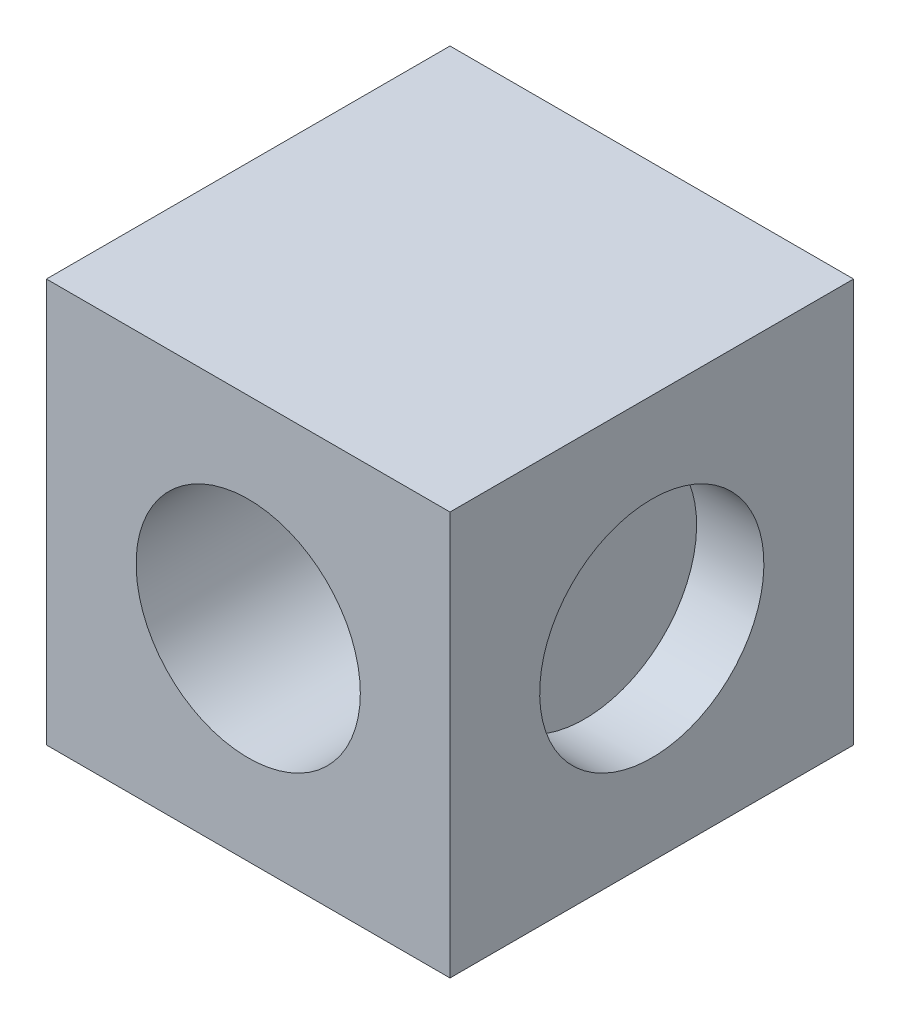
ISO-10303-21;
HEADER;
FILE_DESCRIPTION(('STEP AP214'),'2;1');
FILE_NAME('part.step','',(''),(''),'','','');
FILE_SCHEMA(('AUTOMOTIVE_DESIGN { 1 0 10303 214 1 1 1 1 }'));
ENDSEC;
DATA;
#1=APPLICATION_CONTEXT('core data for automotive mechanical design processes');
#2=APPLICATION_PROTOCOL_DEFINITION('international standard','automotive_design',2000,#1);
#3=PRODUCT_CONTEXT('',#1,'mechanical');
#4=PRODUCT('Part','Part','',(#3));
#5=PRODUCT_RELATED_PRODUCT_CATEGORY('part','',(#4));
#6=PRODUCT_DEFINITION_FORMATION('','',#4);
#7=PRODUCT_DEFINITION_CONTEXT('part definition',#1,'design');
#8=PRODUCT_DEFINITION('design','',#6,#7);
#9=PRODUCT_DEFINITION_SHAPE('','',#8);
#10=(LENGTH_UNIT() NAMED_UNIT(*) SI_UNIT(.MILLI.,.METRE.));
#11=(NAMED_UNIT(*) PLANE_ANGLE_UNIT() SI_UNIT($,.RADIAN.));
#12=(NAMED_UNIT(*) SI_UNIT($,.STERADIAN.) SOLID_ANGLE_UNIT());
#13=UNCERTAINTY_MEASURE_WITH_UNIT(LENGTH_MEASURE(1.E-05),#10,'distance_accuracy_value','');
#14=(GEOMETRIC_REPRESENTATION_CONTEXT(3) GLOBAL_UNCERTAINTY_ASSIGNED_CONTEXT((#13)) GLOBAL_UNIT_ASSIGNED_CONTEXT((#10,
#11,#12)) REPRESENTATION_CONTEXT('',''));
#15=CARTESIAN_POINT('',(0.,0.,0.));
#16=DIRECTION('',(0.,0.,1.));
#17=DIRECTION('',(1.,0.,0.));
#18=AXIS2_PLACEMENT_3D('',#15,#16,#17);
#19=CARTESIAN_POINT('',(0.,0.,18.));
#20=DIRECTION('',(0.,0.,1.));
#21=DIRECTION('',(1.,0.,0.));
#22=AXIS2_PLACEMENT_3D('',#19,#20,#21);
#23=PLANE('',#22);
#24=DIRECTION('',(0.,1.,0.));
#25=VECTOR('',#24,1.);
#26=CARTESIAN_POINT('',(9.,9.,18.));
#27=LINE('',#26,#25);
#28=CARTESIAN_POINT('',(9.,-9.,18.));
#29=VERTEX_POINT('',#28);
#30=CARTESIAN_POINT('',(9.,9.,18.));
#31=VERTEX_POINT('',#30);
#32=EDGE_CURVE('E91',#29,#31,#27,.T.);
#33=ORIENTED_EDGE('',*,*,#32,.T.);
#34=DIRECTION('',(-1.,0.,0.));
#35=VECTOR('',#34,1.);
#36=CARTESIAN_POINT('',(-9.,9.,18.));
#37=LINE('',#36,#35);
#38=CARTESIAN_POINT('',(-9.,9.,18.));
#39=VERTEX_POINT('',#38);
#40=EDGE_CURVE('E86',#31,#39,#37,.T.);
#41=ORIENTED_EDGE('',*,*,#40,.T.);
#42=DIRECTION('',(0.,-1.,0.));
#43=VECTOR('',#42,1.);
#44=CARTESIAN_POINT('',(-9.,9.,18.));
#45=LINE('',#44,#43);
#46=CARTESIAN_POINT('',(-9.,-9.,18.));
#47=VERTEX_POINT('',#46);
#48=EDGE_CURVE('E89',#39,#47,#45,.T.);
#49=ORIENTED_EDGE('',*,*,#48,.T.);
#50=DIRECTION('',(1.,0.,0.));
#51=VECTOR('',#50,1.);
#52=CARTESIAN_POINT('',(-9.,-9.,18.));
#53=LINE('',#52,#51);
#54=EDGE_CURVE('E56',#47,#29,#53,.T.);
#55=ORIENTED_EDGE('',*,*,#54,.T.);
#56=EDGE_LOOP('',(#33,#41,#49,#55));
#57=FACE_BOUND('',#56,.T.);
#58=CARTESIAN_POINT('',(0.,0.,18.));
#59=DIRECTION('',(0.,0.,1.));
#60=DIRECTION('',(1.,0.,0.));
#61=AXIS2_PLACEMENT_3D('',#58,#59,#60);
#62=CIRCLE('',#61,5.);
#63=CARTESIAN_POINT('',(5.,0.,18.));
#64=VERTEX_POINT('',#63);
#65=EDGE_CURVE('E106',#64,#64,#62,.T.);
#66=ORIENTED_EDGE('',*,*,#65,.F.);
#67=EDGE_LOOP('',(#66));
#68=FACE_BOUND('',#67,.T.);
#69=ADVANCED_FACE('F39',(#57,#68),#23,.T.);
#70=CARTESIAN_POINT('',(0.,0.,0.));
#71=DIRECTION('',(0.,0.,1.));
#72=DIRECTION('',(1.,0.,0.));
#73=AXIS2_PLACEMENT_3D('',#70,#71,#72);
#74=PLANE('',#73);
#75=DIRECTION('',(0.,1.,0.));
#76=VECTOR('',#75,1.);
#77=CARTESIAN_POINT('',(9.,9.,0.));
#78=LINE('',#77,#76);
#79=CARTESIAN_POINT('',(9.,-9.,0.));
#80=VERTEX_POINT('',#79);
#81=CARTESIAN_POINT('',(9.,9.,0.));
#82=VERTEX_POINT('',#81);
#83=EDGE_CURVE('E103',#80,#82,#78,.T.);
#84=ORIENTED_EDGE('',*,*,#83,.F.);
#85=DIRECTION('',(1.,0.,0.));
#86=VECTOR('',#85,1.);
#87=CARTESIAN_POINT('',(-9.,-9.,0.));
#88=LINE('',#87,#86);
#89=CARTESIAN_POINT('',(-9.,-9.,0.));
#90=VERTEX_POINT('',#89);
#91=EDGE_CURVE('E79',#90,#80,#88,.T.);
#92=ORIENTED_EDGE('',*,*,#91,.F.);
#93=DIRECTION('',(0.,-1.,0.));
#94=VECTOR('',#93,1.);
#95=CARTESIAN_POINT('',(-9.,9.,0.));
#96=LINE('',#95,#94);
#97=CARTESIAN_POINT('',(-9.,9.,0.));
#98=VERTEX_POINT('',#97);
#99=EDGE_CURVE('E73',#98,#90,#96,.T.);
#100=ORIENTED_EDGE('',*,*,#99,.F.);
#101=DIRECTION('',(-1.,0.,0.));
#102=VECTOR('',#101,1.);
#103=CARTESIAN_POINT('',(-9.,9.,0.));
#104=LINE('',#103,#102);
#105=EDGE_CURVE('E95',#82,#98,#104,.T.);
#106=ORIENTED_EDGE('',*,*,#105,.F.);
#107=EDGE_LOOP('',(#84,#92,#100,#106));
#108=FACE_BOUND('',#107,.T.);
#109=CARTESIAN_POINT('',(0.,0.,0.));
#110=DIRECTION('',(0.,0.,1.));
#111=DIRECTION('',(1.,0.,0.));
#112=AXIS2_PLACEMENT_3D('',#109,#110,#111);
#113=CIRCLE('',#112,5.);
#114=CARTESIAN_POINT('',(5.,0.,0.));
#115=VERTEX_POINT('',#114);
#116=EDGE_CURVE('E118',#115,#115,#113,.T.);
#117=ORIENTED_EDGE('',*,*,#116,.T.);
#118=EDGE_LOOP('',(#117));
#119=FACE_BOUND('',#118,.T.);
#120=ADVANCED_FACE('F114',(#108,#119),#74,.F.);
#121=CARTESIAN_POINT('',(9.,9.,18.));
#122=DIRECTION('',(-1.,0.,0.));
#123=DIRECTION('',(0.,-1.,0.));
#124=AXIS2_PLACEMENT_3D('',#121,#122,#123);
#125=PLANE('',#124);
#126=CARTESIAN_POINT('',(9.,0.,9.));
#127=DIRECTION('',(1.,0.,0.));
#128=DIRECTION('',(0.,1.,0.));
#129=AXIS2_PLACEMENT_3D('',#126,#127,#128);
#130=CIRCLE('',#129,5.);
#131=CARTESIAN_POINT('',(9.,5.,9.));
#132=VERTEX_POINT('',#131);
#133=EDGE_CURVE('E124',#132,#132,#130,.T.);
#134=ORIENTED_EDGE('',*,*,#133,.F.);
#135=EDGE_LOOP('',(#134));
#136=FACE_BOUND('',#135,.T.);
#137=ORIENTED_EDGE('',*,*,#83,.T.);
#138=DIRECTION('',(0.,0.,-1.));
#139=VECTOR('',#138,1.);
#140=CARTESIAN_POINT('',(9.,9.,18.));
#141=LINE('',#140,#139);
#142=EDGE_CURVE('E11',#31,#82,#141,.T.);
#143=ORIENTED_EDGE('',*,*,#142,.F.);
#144=ORIENTED_EDGE('',*,*,#32,.F.);
#145=DIRECTION('',(0.,0.,-1.));
#146=VECTOR('',#145,1.);
#147=CARTESIAN_POINT('',(9.,-9.,18.));
#148=LINE('',#147,#146);
#149=EDGE_CURVE('E99',#29,#80,#148,.T.);
#150=ORIENTED_EDGE('',*,*,#149,.T.);
#151=EDGE_LOOP('',(#137,#143,#144,#150));
#152=FACE_BOUND('',#151,.T.);
#153=ADVANCED_FACE('F41',(#136,#152),#125,.F.);
#154=CARTESIAN_POINT('',(-9.,9.,18.));
#155=DIRECTION('',(0.,-1.,0.));
#156=DIRECTION('',(0.,0.,-1.));
#157=AXIS2_PLACEMENT_3D('',#154,#155,#156);
#158=PLANE('',#157);
#159=ORIENTED_EDGE('',*,*,#105,.T.);
#160=DIRECTION('',(0.,0.,-1.));
#161=VECTOR('',#160,1.);
#162=CARTESIAN_POINT('',(-9.,9.,18.));
#163=LINE('',#162,#161);
#164=EDGE_CURVE('E48',#39,#98,#163,.T.);
#165=ORIENTED_EDGE('',*,*,#164,.F.);
#166=ORIENTED_EDGE('',*,*,#40,.F.);
#167=ORIENTED_EDGE('',*,*,#142,.T.);
#168=EDGE_LOOP('',(#159,#165,#166,#167));
#169=FACE_BOUND('',#168,.T.);
#170=ADVANCED_FACE('F94',(#169),#158,.F.);
#171=CARTESIAN_POINT('',(-9.,9.,18.));
#172=DIRECTION('',(1.,0.,0.));
#173=DIRECTION('',(0.,1.,0.));
#174=AXIS2_PLACEMENT_3D('',#171,#172,#173);
#175=PLANE('',#174);
#176=CARTESIAN_POINT('',(-9.,0.,9.));
#177=DIRECTION('',(1.,0.,0.));
#178=DIRECTION('',(0.,1.,0.));
#179=AXIS2_PLACEMENT_3D('',#176,#177,#178);
#180=CIRCLE('',#179,5.);
#181=CARTESIAN_POINT('',(-9.,5.,9.));
#182=VERTEX_POINT('',#181);
#183=EDGE_CURVE('E130',#182,#182,#180,.T.);
#184=ORIENTED_EDGE('',*,*,#183,.T.);
#185=EDGE_LOOP('',(#184));
#186=FACE_BOUND('',#185,.T.);
#187=ORIENTED_EDGE('',*,*,#99,.T.);
#188=DIRECTION('',(0.,0.,-1.));
#189=VECTOR('',#188,1.);
#190=CARTESIAN_POINT('',(-9.,-9.,18.));
#191=LINE('',#190,#189);
#192=EDGE_CURVE('E96',#47,#90,#191,.T.);
#193=ORIENTED_EDGE('',*,*,#192,.F.);
#194=ORIENTED_EDGE('',*,*,#48,.F.);
#195=ORIENTED_EDGE('',*,*,#164,.T.);
#196=EDGE_LOOP('',(#187,#193,#194,#195));
#197=FACE_BOUND('',#196,.T.);
#198=ADVANCED_FACE('F97',(#186,#197),#175,.F.);
#199=CARTESIAN_POINT('',(-9.,-9.,18.));
#200=DIRECTION('',(0.,1.,0.));
#201=DIRECTION('',(0.,0.,1.));
#202=AXIS2_PLACEMENT_3D('',#199,#200,#201);
#203=PLANE('',#202);
#204=ORIENTED_EDGE('',*,*,#91,.T.);
#205=ORIENTED_EDGE('',*,*,#149,.F.);
#206=ORIENTED_EDGE('',*,*,#54,.F.);
#207=ORIENTED_EDGE('',*,*,#192,.T.);
#208=EDGE_LOOP('',(#204,#205,#206,#207));
#209=FACE_BOUND('',#208,.T.);
#210=ADVANCED_FACE('F111',(#209),#203,.F.);
#211=CARTESIAN_POINT('',(0.,0.,18.));
#212=DIRECTION('',(0.,0.,-1.));
#213=DIRECTION('',(-1.,0.,0.));
#214=AXIS2_PLACEMENT_3D('',#211,#212,#213);
#215=CYLINDRICAL_SURFACE('',#214,5.);
#216=ORIENTED_EDGE('',*,*,#65,.T.);
#217=EDGE_LOOP('',(#216));
#218=FACE_BOUND('',#217,.T.);
#219=ORIENTED_EDGE('',*,*,#116,.F.);
#220=EDGE_LOOP('',(#219));
#221=FACE_BOUND('',#220,.T.);
#222=ADVANCED_FACE('F154',(#218,#221),#215,.F.);
#223=CARTESIAN_POINT('',(6.,0.,9.));
#224=DIRECTION('',(1.,0.,0.));
#225=DIRECTION('',(0.,1.,0.));
#226=AXIS2_PLACEMENT_3D('',#223,#224,#225);
#227=CYLINDRICAL_SURFACE('',#226,5.);
#228=CARTESIAN_POINT('',(6.,0.,9.));
#229=DIRECTION('',(1.,0.,0.));
#230=DIRECTION('',(0.,1.,0.));
#231=AXIS2_PLACEMENT_3D('',#228,#229,#230);
#232=CIRCLE('',#231,5.);
#233=CARTESIAN_POINT('',(6.,5.,9.));
#234=VERTEX_POINT('',#233);
#235=EDGE_CURVE('E121',#234,#234,#232,.T.);
#236=ORIENTED_EDGE('',*,*,#235,.F.);
#237=EDGE_LOOP('',(#236));
#238=FACE_BOUND('',#237,.T.);
#239=ORIENTED_EDGE('',*,*,#133,.T.);
#240=EDGE_LOOP('',(#239));
#241=FACE_BOUND('',#240,.T.);
#242=ADVANCED_FACE('F172',(#238,#241),#227,.F.);
#243=CARTESIAN_POINT('',(6.,0.,9.));
#244=DIRECTION('',(1.,0.,0.));
#245=DIRECTION('',(0.,1.,0.));
#246=AXIS2_PLACEMENT_3D('',#243,#244,#245);
#247=PLANE('',#246);
#248=ORIENTED_EDGE('',*,*,#235,.T.);
#249=EDGE_LOOP('',(#248));
#250=FACE_BOUND('',#249,.T.);
#251=ADVANCED_FACE('F145',(#250),#247,.T.);
#252=CARTESIAN_POINT('',(-6.,0.,9.));
#253=DIRECTION('',(-1.,0.,0.));
#254=DIRECTION('',(0.,-1.,0.));
#255=AXIS2_PLACEMENT_3D('',#252,#253,#254);
#256=CYLINDRICAL_SURFACE('',#255,5.);
#257=CARTESIAN_POINT('',(-6.,0.,9.));
#258=DIRECTION('',(1.,0.,0.));
#259=DIRECTION('',(0.,1.,0.));
#260=AXIS2_PLACEMENT_3D('',#257,#258,#259);
#261=CIRCLE('',#260,5.);
#262=CARTESIAN_POINT('',(-6.,5.,9.));
#263=VERTEX_POINT('',#262);
#264=EDGE_CURVE('E127',#263,#263,#261,.T.);
#265=ORIENTED_EDGE('',*,*,#264,.T.);
#266=EDGE_LOOP('',(#265));
#267=FACE_BOUND('',#266,.T.);
#268=ORIENTED_EDGE('',*,*,#183,.F.);
#269=EDGE_LOOP('',(#268));
#270=FACE_BOUND('',#269,.T.);
#271=ADVANCED_FACE('F136',(#267,#270),#256,.F.);
#272=CARTESIAN_POINT('',(-6.,0.,9.));
#273=DIRECTION('',(-1.,0.,0.));
#274=DIRECTION('',(0.,1.,0.));
#275=AXIS2_PLACEMENT_3D('',#272,#273,#274);
#276=PLANE('',#275);
#277=ORIENTED_EDGE('',*,*,#264,.F.);
#278=EDGE_LOOP('',(#277));
#279=FACE_BOUND('',#278,.T.);
#280=ADVANCED_FACE('F139',(#279),#276,.T.);
#281=CLOSED_SHELL('',(#69,#120,#153,#170,#198,#210,#222,#242,#251,#271,#280));
#282=MANIFOLD_SOLID_BREP('B2',#281);
#283=ADVANCED_BREP_SHAPE_REPRESENTATION('',(#18,#282),#14);
#284=SHAPE_DEFINITION_REPRESENTATION(#9,#283);
ENDSEC;
END-ISO-10303-21;
